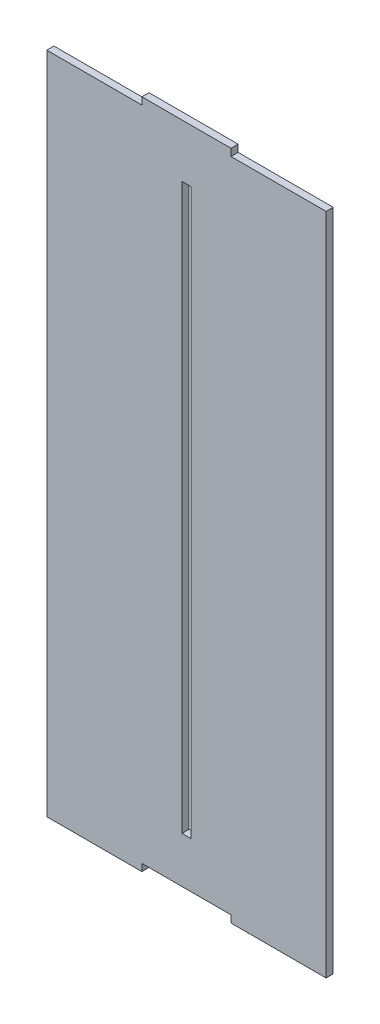
ISO-10303-21;
HEADER;
FILE_DESCRIPTION(('STEP AP214'),'2;1');
FILE_NAME('part.step','',(''),(''),'','','');
FILE_SCHEMA(('AUTOMOTIVE_DESIGN { 1 0 10303 214 1 1 1 1 }'));
ENDSEC;
DATA;
#1=APPLICATION_CONTEXT('core data for automotive mechanical design processes');
#2=APPLICATION_PROTOCOL_DEFINITION('international standard','automotive_design',2000,#1);
#3=PRODUCT_CONTEXT('',#1,'mechanical');
#4=PRODUCT('Part','Part','',(#3));
#5=PRODUCT_RELATED_PRODUCT_CATEGORY('part','',(#4));
#6=PRODUCT_DEFINITION_FORMATION('','',#4);
#7=PRODUCT_DEFINITION_CONTEXT('part definition',#1,'design');
#8=PRODUCT_DEFINITION('design','',#6,#7);
#9=PRODUCT_DEFINITION_SHAPE('','',#8);
#10=(LENGTH_UNIT() NAMED_UNIT(*) SI_UNIT(.MILLI.,.METRE.));
#11=(NAMED_UNIT(*) PLANE_ANGLE_UNIT() SI_UNIT($,.RADIAN.));
#12=(NAMED_UNIT(*) SI_UNIT($,.STERADIAN.) SOLID_ANGLE_UNIT());
#13=UNCERTAINTY_MEASURE_WITH_UNIT(LENGTH_MEASURE(1.E-05),#10,'distance_accuracy_value','');
#14=(GEOMETRIC_REPRESENTATION_CONTEXT(3) GLOBAL_UNCERTAINTY_ASSIGNED_CONTEXT((#13)) GLOBAL_UNIT_ASSIGNED_CONTEXT((#10,
#11,#12)) REPRESENTATION_CONTEXT('',''));
#15=CARTESIAN_POINT('',(0.,0.,0.));
#16=DIRECTION('',(0.,0.,1.));
#17=DIRECTION('',(1.,0.,0.));
#18=AXIS2_PLACEMENT_3D('',#15,#16,#17);
#19=CARTESIAN_POINT('',(0.,0.,6.));
#20=DIRECTION('',(0.,0.,-1.));
#21=DIRECTION('',(-1.,0.,0.));
#22=AXIS2_PLACEMENT_3D('',#19,#20,#21);
#23=PLANE('',#22);
#24=DIRECTION('',(0.,-1.,0.));
#25=VECTOR('',#24,1.);
#26=CARTESIAN_POINT('',(0.,0.,6.));
#27=LINE('',#26,#25);
#28=CARTESIAN_POINT('',(0.,558.5,6.));
#29=VERTEX_POINT('',#28);
#30=CARTESIAN_POINT('',(0.,0.,6.));
#31=VERTEX_POINT('',#30);
#32=EDGE_CURVE('E201',#29,#31,#27,.T.);
#33=ORIENTED_EDGE('',*,*,#32,.T.);
#34=DIRECTION('',(1.,0.,0.));
#35=VECTOR('',#34,1.);
#36=CARTESIAN_POINT('',(0.,0.,6.));
#37=LINE('',#36,#35);
#38=CARTESIAN_POINT('',(80.,0.,6.));
#39=VERTEX_POINT('',#38);
#40=EDGE_CURVE('E205',#31,#39,#37,.T.);
#41=ORIENTED_EDGE('',*,*,#40,.T.);
#42=DIRECTION('',(0.,1.,0.));
#43=VECTOR('',#42,1.);
#44=CARTESIAN_POINT('',(80.,0.,6.));
#45=LINE('',#44,#43);
#46=CARTESIAN_POINT('',(80.,6.,6.));
#47=VERTEX_POINT('',#46);
#48=EDGE_CURVE('E209',#39,#47,#45,.T.);
#49=ORIENTED_EDGE('',*,*,#48,.T.);
#50=DIRECTION('',(1.,0.,0.));
#51=VECTOR('',#50,1.);
#52=CARTESIAN_POINT('',(80.,6.,6.));
#53=LINE('',#52,#51);
#54=CARTESIAN_POINT('',(155.,6.,6.));
#55=VERTEX_POINT('',#54);
#56=EDGE_CURVE('E212',#47,#55,#53,.T.);
#57=ORIENTED_EDGE('',*,*,#56,.T.);
#58=DIRECTION('',(0.,-1.,0.));
#59=VECTOR('',#58,1.);
#60=CARTESIAN_POINT('',(155.,0.,6.));
#61=LINE('',#60,#59);
#62=CARTESIAN_POINT('',(155.,0.,6.));
#63=VERTEX_POINT('',#62);
#64=EDGE_CURVE('E215',#55,#63,#61,.T.);
#65=ORIENTED_EDGE('',*,*,#64,.T.);
#66=DIRECTION('',(1.,0.,0.));
#67=VECTOR('',#66,1.);
#68=CARTESIAN_POINT('',(155.,0.,6.));
#69=LINE('',#68,#67);
#70=CARTESIAN_POINT('',(235.,0.,6.));
#71=VERTEX_POINT('',#70);
#72=EDGE_CURVE('E218',#63,#71,#69,.T.);
#73=ORIENTED_EDGE('',*,*,#72,.T.);
#74=DIRECTION('',(0.,1.,0.));
#75=VECTOR('',#74,1.);
#76=CARTESIAN_POINT('',(235.,0.,6.));
#77=LINE('',#76,#75);
#78=CARTESIAN_POINT('',(235.,558.5,6.));
#79=VERTEX_POINT('',#78);
#80=EDGE_CURVE('E221',#71,#79,#77,.T.);
#81=ORIENTED_EDGE('',*,*,#80,.T.);
#82=DIRECTION('',(-1.,0.,0.));
#83=VECTOR('',#82,1.);
#84=CARTESIAN_POINT('',(155.,558.5,6.));
#85=LINE('',#84,#83);
#86=CARTESIAN_POINT('',(155.,558.5,6.));
#87=VERTEX_POINT('',#86);
#88=EDGE_CURVE('E224',#79,#87,#85,.T.);
#89=ORIENTED_EDGE('',*,*,#88,.T.);
#90=DIRECTION('',(0.,1.,0.));
#91=VECTOR('',#90,1.);
#92=CARTESIAN_POINT('',(155.,558.5,6.));
#93=LINE('',#92,#91);
#94=CARTESIAN_POINT('',(155.,564.5,6.));
#95=VERTEX_POINT('',#94);
#96=EDGE_CURVE('E227',#87,#95,#93,.T.);
#97=ORIENTED_EDGE('',*,*,#96,.T.);
#98=DIRECTION('',(-1.,0.,0.));
#99=VECTOR('',#98,1.);
#100=CARTESIAN_POINT('',(80.,564.5,6.));
#101=LINE('',#100,#99);
#102=CARTESIAN_POINT('',(80.,564.5,6.));
#103=VERTEX_POINT('',#102);
#104=EDGE_CURVE('E230',#95,#103,#101,.T.);
#105=ORIENTED_EDGE('',*,*,#104,.T.);
#106=DIRECTION('',(0.,-1.,0.));
#107=VECTOR('',#106,1.);
#108=CARTESIAN_POINT('',(80.,558.5,6.));
#109=LINE('',#108,#107);
#110=CARTESIAN_POINT('',(80.,558.5,6.));
#111=VERTEX_POINT('',#110);
#112=EDGE_CURVE('E233',#103,#111,#109,.T.);
#113=ORIENTED_EDGE('',*,*,#112,.T.);
#114=DIRECTION('',(-1.,0.,0.));
#115=VECTOR('',#114,1.);
#116=CARTESIAN_POINT('',(0.,558.5,6.));
#117=LINE('',#116,#115);
#118=EDGE_CURVE('E236',#111,#29,#117,.T.);
#119=ORIENTED_EDGE('',*,*,#118,.T.);
#120=EDGE_LOOP('',(#33,#41,#49,#57,#65,#73,#81,#89,#97,#105,#113,#119));
#121=FACE_BOUND('',#120,.T.);
#122=DIRECTION('',(0.,-1.,0.));
#123=VECTOR('',#122,1.);
#124=CARTESIAN_POINT('',(113.75,44.7500000000003,6.));
#125=LINE('',#124,#123);
#126=CARTESIAN_POINT('',(113.75,519.75,6.));
#127=VERTEX_POINT('',#126);
#128=CARTESIAN_POINT('',(113.75,44.7500000000003,6.));
#129=VERTEX_POINT('',#128);
#130=EDGE_CURVE('E153',#127,#129,#125,.T.);
#131=ORIENTED_EDGE('',*,*,#130,.F.);
#132=DIRECTION('',(-1.,0.,0.));
#133=VECTOR('',#132,1.);
#134=CARTESIAN_POINT('',(121.25,519.75,6.));
#135=LINE('',#134,#133);
#136=CARTESIAN_POINT('',(121.25,519.75,6.));
#137=VERTEX_POINT('',#136);
#138=EDGE_CURVE('E179',#137,#127,#135,.T.);
#139=ORIENTED_EDGE('',*,*,#138,.F.);
#140=DIRECTION('',(0.,1.,0.));
#141=VECTOR('',#140,1.);
#142=CARTESIAN_POINT('',(121.25,44.7500000000003,6.));
#143=LINE('',#142,#141);
#144=CARTESIAN_POINT('',(121.25,44.7500000000003,6.));
#145=VERTEX_POINT('',#144);
#146=EDGE_CURVE('E175',#145,#137,#143,.T.);
#147=ORIENTED_EDGE('',*,*,#146,.F.);
#148=DIRECTION('',(1.,0.,0.));
#149=VECTOR('',#148,1.);
#150=CARTESIAN_POINT('',(121.25,44.7500000000003,6.));
#151=LINE('',#150,#149);
#152=EDGE_CURVE('E162',#129,#145,#151,.T.);
#153=ORIENTED_EDGE('',*,*,#152,.F.);
#154=EDGE_LOOP('',(#131,#139,#147,#153));
#155=FACE_BOUND('',#154,.T.);
#156=ADVANCED_FACE('F39',(#121,#155),#23,.F.);
#157=CARTESIAN_POINT('',(0.,0.,0.));
#158=DIRECTION('',(0.,0.,-1.));
#159=DIRECTION('',(-1.,0.,0.));
#160=AXIS2_PLACEMENT_3D('',#157,#158,#159);
#161=PLANE('',#160);
#162=DIRECTION('',(0.,-1.,0.));
#163=VECTOR('',#162,1.);
#164=CARTESIAN_POINT('',(0.,0.,0.));
#165=LINE('',#164,#163);
#166=CARTESIAN_POINT('',(0.,558.5,0.));
#167=VERTEX_POINT('',#166);
#168=CARTESIAN_POINT('',(0.,0.,0.));
#169=VERTEX_POINT('',#168);
#170=EDGE_CURVE('E171',#167,#169,#165,.T.);
#171=ORIENTED_EDGE('',*,*,#170,.F.);
#172=DIRECTION('',(-1.,0.,0.));
#173=VECTOR('',#172,1.);
#174=CARTESIAN_POINT('',(0.,558.5,0.));
#175=LINE('',#174,#173);
#176=CARTESIAN_POINT('',(80.,558.5,0.));
#177=VERTEX_POINT('',#176);
#178=EDGE_CURVE('E206',#177,#167,#175,.T.);
#179=ORIENTED_EDGE('',*,*,#178,.F.);
#180=DIRECTION('',(0.,-1.,0.));
#181=VECTOR('',#180,1.);
#182=CARTESIAN_POINT('',(80.,558.5,0.));
#183=LINE('',#182,#181);
#184=CARTESIAN_POINT('',(80.,564.5,0.));
#185=VERTEX_POINT('',#184);
#186=EDGE_CURVE('E270',#185,#177,#183,.T.);
#187=ORIENTED_EDGE('',*,*,#186,.F.);
#188=DIRECTION('',(-1.,0.,0.));
#189=VECTOR('',#188,1.);
#190=CARTESIAN_POINT('',(80.,564.5,0.));
#191=LINE('',#190,#189);
#192=CARTESIAN_POINT('',(155.,564.5,0.));
#193=VERTEX_POINT('',#192);
#194=EDGE_CURVE('E267',#193,#185,#191,.T.);
#195=ORIENTED_EDGE('',*,*,#194,.F.);
#196=DIRECTION('',(0.,1.,0.));
#197=VECTOR('',#196,1.);
#198=CARTESIAN_POINT('',(155.,558.5,0.));
#199=LINE('',#198,#197);
#200=CARTESIAN_POINT('',(155.,558.5,0.));
#201=VERTEX_POINT('',#200);
#202=EDGE_CURVE('E264',#201,#193,#199,.T.);
#203=ORIENTED_EDGE('',*,*,#202,.F.);
#204=DIRECTION('',(-1.,0.,0.));
#205=VECTOR('',#204,1.);
#206=CARTESIAN_POINT('',(155.,558.5,0.));
#207=LINE('',#206,#205);
#208=CARTESIAN_POINT('',(235.,558.5,0.));
#209=VERTEX_POINT('',#208);
#210=EDGE_CURVE('E261',#209,#201,#207,.T.);
#211=ORIENTED_EDGE('',*,*,#210,.F.);
#212=DIRECTION('',(0.,1.,0.));
#213=VECTOR('',#212,1.);
#214=CARTESIAN_POINT('',(235.,0.,0.));
#215=LINE('',#214,#213);
#216=CARTESIAN_POINT('',(235.,0.,0.));
#217=VERTEX_POINT('',#216);
#218=EDGE_CURVE('E258',#217,#209,#215,.T.);
#219=ORIENTED_EDGE('',*,*,#218,.F.);
#220=DIRECTION('',(1.,0.,0.));
#221=VECTOR('',#220,1.);
#222=CARTESIAN_POINT('',(155.,0.,0.));
#223=LINE('',#222,#221);
#224=CARTESIAN_POINT('',(155.,0.,0.));
#225=VERTEX_POINT('',#224);
#226=EDGE_CURVE('E255',#225,#217,#223,.T.);
#227=ORIENTED_EDGE('',*,*,#226,.F.);
#228=DIRECTION('',(0.,-1.,0.));
#229=VECTOR('',#228,1.);
#230=CARTESIAN_POINT('',(155.,0.,0.));
#231=LINE('',#230,#229);
#232=CARTESIAN_POINT('',(155.,6.,0.));
#233=VERTEX_POINT('',#232);
#234=EDGE_CURVE('E252',#233,#225,#231,.T.);
#235=ORIENTED_EDGE('',*,*,#234,.F.);
#236=DIRECTION('',(1.,0.,0.));
#237=VECTOR('',#236,1.);
#238=CARTESIAN_POINT('',(80.,6.,0.));
#239=LINE('',#238,#237);
#240=CARTESIAN_POINT('',(80.,6.,0.));
#241=VERTEX_POINT('',#240);
#242=EDGE_CURVE('E249',#241,#233,#239,.T.);
#243=ORIENTED_EDGE('',*,*,#242,.F.);
#244=DIRECTION('',(0.,1.,0.));
#245=VECTOR('',#244,1.);
#246=CARTESIAN_POINT('',(80.,0.,0.));
#247=LINE('',#246,#245);
#248=CARTESIAN_POINT('',(80.,0.,0.));
#249=VERTEX_POINT('',#248);
#250=EDGE_CURVE('E246',#249,#241,#247,.T.);
#251=ORIENTED_EDGE('',*,*,#250,.F.);
#252=DIRECTION('',(1.,0.,0.));
#253=VECTOR('',#252,1.);
#254=CARTESIAN_POINT('',(0.,0.,0.));
#255=LINE('',#254,#253);
#256=EDGE_CURVE('E243',#169,#249,#255,.T.);
#257=ORIENTED_EDGE('',*,*,#256,.F.);
#258=EDGE_LOOP('',(#171,#179,#187,#195,#203,#211,#219,#227,#235,#243,#251,#257));
#259=FACE_BOUND('',#258,.T.);
#260=DIRECTION('',(-1.,0.,0.));
#261=VECTOR('',#260,1.);
#262=CARTESIAN_POINT('',(121.25,519.75,0.));
#263=LINE('',#262,#261);
#264=CARTESIAN_POINT('',(121.25,519.75,0.));
#265=VERTEX_POINT('',#264);
#266=CARTESIAN_POINT('',(113.75,519.75,0.));
#267=VERTEX_POINT('',#266);
#268=EDGE_CURVE('E163',#265,#267,#263,.T.);
#269=ORIENTED_EDGE('',*,*,#268,.T.);
#270=DIRECTION('',(0.,-1.,0.));
#271=VECTOR('',#270,1.);
#272=CARTESIAN_POINT('',(113.75,44.7500000000003,0.));
#273=LINE('',#272,#271);
#274=CARTESIAN_POINT('',(113.75,44.7500000000003,0.));
#275=VERTEX_POINT('',#274);
#276=EDGE_CURVE('E63',#267,#275,#273,.T.);
#277=ORIENTED_EDGE('',*,*,#276,.T.);
#278=DIRECTION('',(1.,0.,0.));
#279=VECTOR('',#278,1.);
#280=CARTESIAN_POINT('',(121.25,44.7500000000003,0.));
#281=LINE('',#280,#279);
#282=CARTESIAN_POINT('',(121.25,44.7500000000003,0.));
#283=VERTEX_POINT('',#282);
#284=EDGE_CURVE('E169',#275,#283,#281,.T.);
#285=ORIENTED_EDGE('',*,*,#284,.T.);
#286=DIRECTION('',(0.,1.,0.));
#287=VECTOR('',#286,1.);
#288=CARTESIAN_POINT('',(121.25,44.7500000000003,0.));
#289=LINE('',#288,#287);
#290=EDGE_CURVE('E188',#283,#265,#289,.T.);
#291=ORIENTED_EDGE('',*,*,#290,.T.);
#292=EDGE_LOOP('',(#269,#277,#285,#291));
#293=FACE_BOUND('',#292,.T.);
#294=ADVANCED_FACE('F325',(#259,#293),#161,.T.);
#295=CARTESIAN_POINT('',(0.,0.,6.));
#296=DIRECTION('',(1.,0.,0.));
#297=DIRECTION('',(0.,0.,-1.));
#298=AXIS2_PLACEMENT_3D('',#295,#296,#297);
#299=PLANE('',#298);
#300=ORIENTED_EDGE('',*,*,#170,.T.);
#301=DIRECTION('',(0.,0.,-1.));
#302=VECTOR('',#301,1.);
#303=CARTESIAN_POINT('',(0.,0.,6.));
#304=LINE('',#303,#302);
#305=EDGE_CURVE('E11',#31,#169,#304,.T.);
#306=ORIENTED_EDGE('',*,*,#305,.F.);
#307=ORIENTED_EDGE('',*,*,#32,.F.);
#308=DIRECTION('',(0.,0.,-1.));
#309=VECTOR('',#308,1.);
#310=CARTESIAN_POINT('',(0.,558.5,6.));
#311=LINE('',#310,#309);
#312=EDGE_CURVE('E239',#29,#167,#311,.T.);
#313=ORIENTED_EDGE('',*,*,#312,.T.);
#314=EDGE_LOOP('',(#300,#306,#307,#313));
#315=FACE_BOUND('',#314,.T.);
#316=ADVANCED_FACE('F41',(#315),#299,.F.);
#317=CARTESIAN_POINT('',(0.,0.,6.));
#318=DIRECTION('',(0.,1.,0.));
#319=DIRECTION('',(0.,0.,1.));
#320=AXIS2_PLACEMENT_3D('',#317,#318,#319);
#321=PLANE('',#320);
#322=ORIENTED_EDGE('',*,*,#256,.T.);
#323=DIRECTION('',(0.,0.,-1.));
#324=VECTOR('',#323,1.);
#325=CARTESIAN_POINT('',(80.,0.,6.));
#326=LINE('',#325,#324);
#327=EDGE_CURVE('E48',#39,#249,#326,.T.);
#328=ORIENTED_EDGE('',*,*,#327,.F.);
#329=ORIENTED_EDGE('',*,*,#40,.F.);
#330=ORIENTED_EDGE('',*,*,#305,.T.);
#331=EDGE_LOOP('',(#322,#328,#329,#330));
#332=FACE_BOUND('',#331,.T.);
#333=ADVANCED_FACE('F342',(#332),#321,.F.);
#334=CARTESIAN_POINT('',(80.,0.,6.));
#335=DIRECTION('',(-1.,0.,0.));
#336=DIRECTION('',(0.,0.,1.));
#337=AXIS2_PLACEMENT_3D('',#334,#335,#336);
#338=PLANE('',#337);
#339=ORIENTED_EDGE('',*,*,#250,.T.);
#340=DIRECTION('',(0.,0.,-1.));
#341=VECTOR('',#340,1.);
#342=CARTESIAN_POINT('',(80.,6.,6.));
#343=LINE('',#342,#341);
#344=EDGE_CURVE('E310',#47,#241,#343,.T.);
#345=ORIENTED_EDGE('',*,*,#344,.F.);
#346=ORIENTED_EDGE('',*,*,#48,.F.);
#347=ORIENTED_EDGE('',*,*,#327,.T.);
#348=EDGE_LOOP('',(#339,#345,#346,#347));
#349=FACE_BOUND('',#348,.T.);
#350=ADVANCED_FACE('F319',(#349),#338,.F.);
#351=CARTESIAN_POINT('',(80.,6.,6.));
#352=DIRECTION('',(0.,1.,0.));
#353=DIRECTION('',(-1.,0.,0.));
#354=AXIS2_PLACEMENT_3D('',#351,#352,#353);
#355=PLANE('',#354);
#356=ORIENTED_EDGE('',*,*,#242,.T.);
#357=DIRECTION('',(0.,0.,-1.));
#358=VECTOR('',#357,1.);
#359=CARTESIAN_POINT('',(155.,6.,6.));
#360=LINE('',#359,#358);
#361=EDGE_CURVE('E306',#55,#233,#360,.T.);
#362=ORIENTED_EDGE('',*,*,#361,.F.);
#363=ORIENTED_EDGE('',*,*,#56,.F.);
#364=ORIENTED_EDGE('',*,*,#344,.T.);
#365=EDGE_LOOP('',(#356,#362,#363,#364));
#366=FACE_BOUND('',#365,.T.);
#367=ADVANCED_FACE('F331',(#366),#355,.F.);
#368=CARTESIAN_POINT('',(155.,0.,6.));
#369=DIRECTION('',(1.,0.,0.));
#370=DIRECTION('',(0.,0.,-1.));
#371=AXIS2_PLACEMENT_3D('',#368,#369,#370);
#372=PLANE('',#371);
#373=ORIENTED_EDGE('',*,*,#234,.T.);
#374=DIRECTION('',(0.,0.,-1.));
#375=VECTOR('',#374,1.);
#376=CARTESIAN_POINT('',(155.,0.,6.));
#377=LINE('',#376,#375);
#378=EDGE_CURVE('E302',#63,#225,#377,.T.);
#379=ORIENTED_EDGE('',*,*,#378,.F.);
#380=ORIENTED_EDGE('',*,*,#64,.F.);
#381=ORIENTED_EDGE('',*,*,#361,.T.);
#382=EDGE_LOOP('',(#373,#379,#380,#381));
#383=FACE_BOUND('',#382,.T.);
#384=ADVANCED_FACE('F335',(#383),#372,.F.);
#385=CARTESIAN_POINT('',(155.,0.,6.));
#386=DIRECTION('',(0.,1.,0.));
#387=DIRECTION('',(0.,0.,1.));
#388=AXIS2_PLACEMENT_3D('',#385,#386,#387);
#389=PLANE('',#388);
#390=ORIENTED_EDGE('',*,*,#226,.T.);
#391=DIRECTION('',(0.,0.,-1.));
#392=VECTOR('',#391,1.);
#393=CARTESIAN_POINT('',(235.,0.,6.));
#394=LINE('',#393,#392);
#395=EDGE_CURVE('E298',#71,#217,#394,.T.);
#396=ORIENTED_EDGE('',*,*,#395,.F.);
#397=ORIENTED_EDGE('',*,*,#72,.F.);
#398=ORIENTED_EDGE('',*,*,#378,.T.);
#399=EDGE_LOOP('',(#390,#396,#397,#398));
#400=FACE_BOUND('',#399,.T.);
#401=ADVANCED_FACE('F375',(#400),#389,.F.);
#402=CARTESIAN_POINT('',(235.,0.,6.));
#403=DIRECTION('',(-1.,0.,0.));
#404=DIRECTION('',(0.,-1.,0.));
#405=AXIS2_PLACEMENT_3D('',#402,#403,#404);
#406=PLANE('',#405);
#407=ORIENTED_EDGE('',*,*,#218,.T.);
#408=DIRECTION('',(0.,0.,-1.));
#409=VECTOR('',#408,1.);
#410=CARTESIAN_POINT('',(235.,558.5,6.));
#411=LINE('',#410,#409);
#412=EDGE_CURVE('E294',#79,#209,#411,.T.);
#413=ORIENTED_EDGE('',*,*,#412,.F.);
#414=ORIENTED_EDGE('',*,*,#80,.F.);
#415=ORIENTED_EDGE('',*,*,#395,.T.);
#416=EDGE_LOOP('',(#407,#413,#414,#415));
#417=FACE_BOUND('',#416,.T.);
#418=ADVANCED_FACE('F373',(#417),#406,.F.);
#419=CARTESIAN_POINT('',(155.,558.5,6.));
#420=DIRECTION('',(0.,-1.,0.));
#421=DIRECTION('',(0.,0.,-1.));
#422=AXIS2_PLACEMENT_3D('',#419,#420,#421);
#423=PLANE('',#422);
#424=ORIENTED_EDGE('',*,*,#210,.T.);
#425=DIRECTION('',(0.,0.,-1.));
#426=VECTOR('',#425,1.);
#427=CARTESIAN_POINT('',(155.,558.5,6.));
#428=LINE('',#427,#426);
#429=EDGE_CURVE('E290',#87,#201,#428,.T.);
#430=ORIENTED_EDGE('',*,*,#429,.F.);
#431=ORIENTED_EDGE('',*,*,#88,.F.);
#432=ORIENTED_EDGE('',*,*,#412,.T.);
#433=EDGE_LOOP('',(#424,#430,#431,#432));
#434=FACE_BOUND('',#433,.T.);
#435=ADVANCED_FACE('F369',(#434),#423,.F.);
#436=CARTESIAN_POINT('',(155.,558.5,6.));
#437=DIRECTION('',(-1.,0.,0.));
#438=DIRECTION('',(0.,0.,1.));
#439=AXIS2_PLACEMENT_3D('',#436,#437,#438);
#440=PLANE('',#439);
#441=ORIENTED_EDGE('',*,*,#202,.T.);
#442=DIRECTION('',(0.,0.,-1.));
#443=VECTOR('',#442,1.);
#444=CARTESIAN_POINT('',(155.,564.5,6.));
#445=LINE('',#444,#443);
#446=EDGE_CURVE('E286',#95,#193,#445,.T.);
#447=ORIENTED_EDGE('',*,*,#446,.F.);
#448=ORIENTED_EDGE('',*,*,#96,.F.);
#449=ORIENTED_EDGE('',*,*,#429,.T.);
#450=EDGE_LOOP('',(#441,#447,#448,#449));
#451=FACE_BOUND('',#450,.T.);
#452=ADVANCED_FACE('F364',(#451),#440,.F.);
#453=CARTESIAN_POINT('',(80.,564.5,6.));
#454=DIRECTION('',(0.,-1.,0.));
#455=DIRECTION('',(0.,0.,-1.));
#456=AXIS2_PLACEMENT_3D('',#453,#454,#455);
#457=PLANE('',#456);
#458=ORIENTED_EDGE('',*,*,#194,.T.);
#459=DIRECTION('',(0.,0.,-1.));
#460=VECTOR('',#459,1.);
#461=CARTESIAN_POINT('',(80.,564.5,6.));
#462=LINE('',#461,#460);
#463=EDGE_CURVE('E282',#103,#185,#462,.T.);
#464=ORIENTED_EDGE('',*,*,#463,.F.);
#465=ORIENTED_EDGE('',*,*,#104,.F.);
#466=ORIENTED_EDGE('',*,*,#446,.T.);
#467=EDGE_LOOP('',(#458,#464,#465,#466));
#468=FACE_BOUND('',#467,.T.);
#469=ADVANCED_FACE('F358',(#468),#457,.F.);
#470=CARTESIAN_POINT('',(80.,558.5,6.));
#471=DIRECTION('',(1.,0.,0.));
#472=DIRECTION('',(0.,0.,-1.));
#473=AXIS2_PLACEMENT_3D('',#470,#471,#472);
#474=PLANE('',#473);
#475=ORIENTED_EDGE('',*,*,#186,.T.);
#476=DIRECTION('',(0.,0.,-1.));
#477=VECTOR('',#476,1.);
#478=CARTESIAN_POINT('',(80.,558.5,6.));
#479=LINE('',#478,#477);
#480=EDGE_CURVE('E278',#111,#177,#479,.T.);
#481=ORIENTED_EDGE('',*,*,#480,.F.);
#482=ORIENTED_EDGE('',*,*,#112,.F.);
#483=ORIENTED_EDGE('',*,*,#463,.T.);
#484=EDGE_LOOP('',(#475,#481,#482,#483));
#485=FACE_BOUND('',#484,.T.);
#486=ADVANCED_FACE('F354',(#485),#474,.F.);
#487=CARTESIAN_POINT('',(0.,558.5,6.));
#488=DIRECTION('',(0.,-1.,0.));
#489=DIRECTION('',(0.,0.,-1.));
#490=AXIS2_PLACEMENT_3D('',#487,#488,#489);
#491=PLANE('',#490);
#492=ORIENTED_EDGE('',*,*,#178,.T.);
#493=ORIENTED_EDGE('',*,*,#312,.F.);
#494=ORIENTED_EDGE('',*,*,#118,.F.);
#495=ORIENTED_EDGE('',*,*,#480,.T.);
#496=EDGE_LOOP('',(#492,#493,#494,#495));
#497=FACE_BOUND('',#496,.T.);
#498=ADVANCED_FACE('F349',(#497),#491,.F.);
#499=CARTESIAN_POINT('',(113.75,44.7500000000003,6.));
#500=DIRECTION('',(1.,0.,0.));
#501=DIRECTION('',(0.,0.,-1.));
#502=AXIS2_PLACEMENT_3D('',#499,#500,#501);
#503=PLANE('',#502);
#504=ORIENTED_EDGE('',*,*,#276,.F.);
#505=DIRECTION('',(0.,0.,-1.));
#506=VECTOR('',#505,1.);
#507=CARTESIAN_POINT('',(113.75,519.75,6.));
#508=LINE('',#507,#506);
#509=EDGE_CURVE('E157',#127,#267,#508,.T.);
#510=ORIENTED_EDGE('',*,*,#509,.F.);
#511=ORIENTED_EDGE('',*,*,#130,.T.);
#512=DIRECTION('',(0.,0.,-1.));
#513=VECTOR('',#512,1.);
#514=CARTESIAN_POINT('',(113.75,44.7500000000003,6.));
#515=LINE('',#514,#513);
#516=EDGE_CURVE('E156',#129,#275,#515,.T.);
#517=ORIENTED_EDGE('',*,*,#516,.T.);
#518=EDGE_LOOP('',(#504,#510,#511,#517));
#519=FACE_BOUND('',#518,.T.);
#520=ADVANCED_FACE('F155',(#519),#503,.T.);
#521=CARTESIAN_POINT('',(121.25,44.7500000000003,6.));
#522=DIRECTION('',(0.,1.,0.));
#523=DIRECTION('',(0.,0.,1.));
#524=AXIS2_PLACEMENT_3D('',#521,#522,#523);
#525=PLANE('',#524);
#526=ORIENTED_EDGE('',*,*,#284,.F.);
#527=ORIENTED_EDGE('',*,*,#516,.F.);
#528=ORIENTED_EDGE('',*,*,#152,.T.);
#529=DIRECTION('',(0.,0.,-1.));
#530=VECTOR('',#529,1.);
#531=CARTESIAN_POINT('',(121.25,44.7500000000003,6.));
#532=LINE('',#531,#530);
#533=EDGE_CURVE('E172',#145,#283,#532,.T.);
#534=ORIENTED_EDGE('',*,*,#533,.T.);
#535=EDGE_LOOP('',(#526,#527,#528,#534));
#536=FACE_BOUND('',#535,.T.);
#537=ADVANCED_FACE('F166',(#536),#525,.T.);
#538=CARTESIAN_POINT('',(121.25,44.7500000000003,6.));
#539=DIRECTION('',(-1.,0.,0.));
#540=DIRECTION('',(0.,0.,1.));
#541=AXIS2_PLACEMENT_3D('',#538,#539,#540);
#542=PLANE('',#541);
#543=ORIENTED_EDGE('',*,*,#290,.F.);
#544=ORIENTED_EDGE('',*,*,#533,.F.);
#545=ORIENTED_EDGE('',*,*,#146,.T.);
#546=DIRECTION('',(0.,0.,-1.));
#547=VECTOR('',#546,1.);
#548=CARTESIAN_POINT('',(121.25,519.75,6.));
#549=LINE('',#548,#547);
#550=EDGE_CURVE('E55',#137,#265,#549,.T.);
#551=ORIENTED_EDGE('',*,*,#550,.T.);
#552=EDGE_LOOP('',(#543,#544,#545,#551));
#553=FACE_BOUND('',#552,.T.);
#554=ADVANCED_FACE('F433',(#553),#542,.T.);
#555=CARTESIAN_POINT('',(121.25,519.75,6.));
#556=DIRECTION('',(0.,-1.,0.));
#557=DIRECTION('',(0.,0.,-1.));
#558=AXIS2_PLACEMENT_3D('',#555,#556,#557);
#559=PLANE('',#558);
#560=ORIENTED_EDGE('',*,*,#268,.F.);
#561=ORIENTED_EDGE('',*,*,#550,.F.);
#562=ORIENTED_EDGE('',*,*,#138,.T.);
#563=ORIENTED_EDGE('',*,*,#509,.T.);
#564=EDGE_LOOP('',(#560,#561,#562,#563));
#565=FACE_BOUND('',#564,.T.);
#566=ADVANCED_FACE('F439',(#565),#559,.T.);
#567=CLOSED_SHELL('',(#156,#294,#316,#333,#350,#367,#384,#401,#418,#435,#452,#469,#486,#498,
#520,#537,#554,#566));
#568=MANIFOLD_SOLID_BREP('B2',#567);
#569=ADVANCED_BREP_SHAPE_REPRESENTATION('',(#18,#568),#14);
#570=SHAPE_DEFINITION_REPRESENTATION(#9,#569);
ENDSEC;
END-ISO-10303-21;
